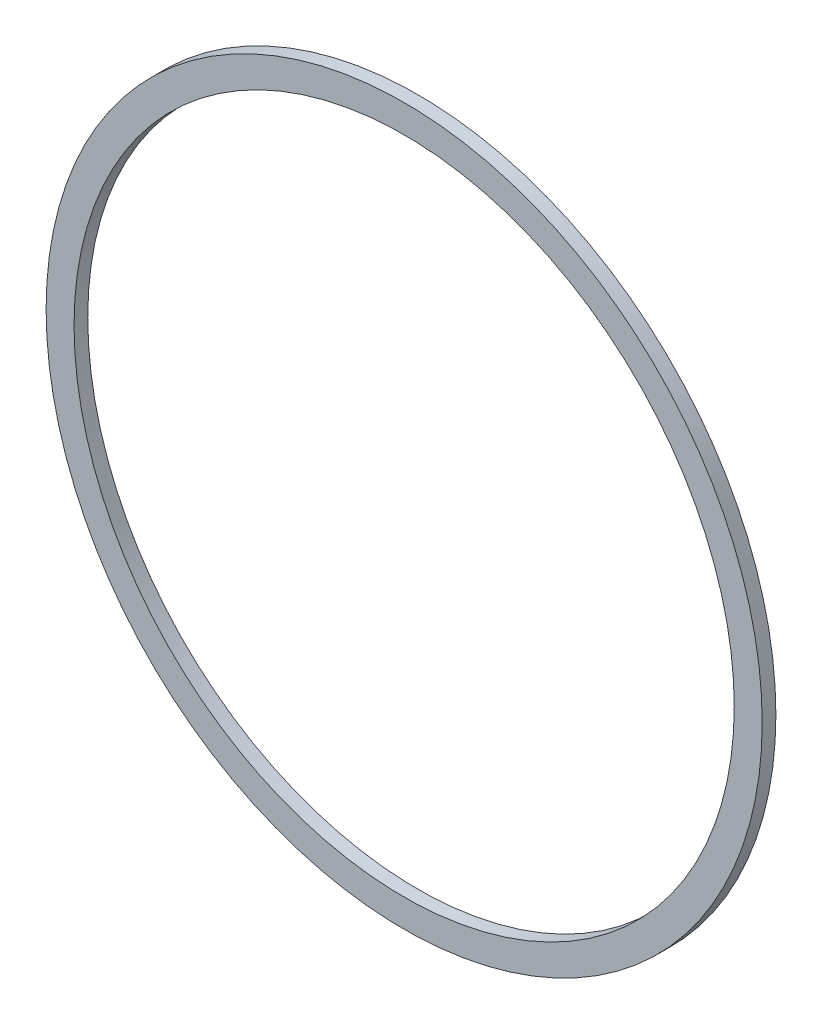
ISO-10303-21;
HEADER;
FILE_DESCRIPTION(('STEP AP214'),'2;1');
FILE_NAME('part.step','',(''),(''),'','','');
FILE_SCHEMA(('AUTOMOTIVE_DESIGN { 1 0 10303 214 1 1 1 1 }'));
ENDSEC;
DATA;
#1=APPLICATION_CONTEXT('core data for automotive mechanical design processes');
#2=APPLICATION_PROTOCOL_DEFINITION('international standard','automotive_design',2000,#1);
#3=PRODUCT_CONTEXT('',#1,'mechanical');
#4=PRODUCT('Part','Part','',(#3));
#5=PRODUCT_RELATED_PRODUCT_CATEGORY('part','',(#4));
#6=PRODUCT_DEFINITION_FORMATION('','',#4);
#7=PRODUCT_DEFINITION_CONTEXT('part definition',#1,'design');
#8=PRODUCT_DEFINITION('design','',#6,#7);
#9=PRODUCT_DEFINITION_SHAPE('','',#8);
#10=(LENGTH_UNIT() NAMED_UNIT(*) SI_UNIT(.MILLI.,.METRE.));
#11=(NAMED_UNIT(*) PLANE_ANGLE_UNIT() SI_UNIT($,.RADIAN.));
#12=(NAMED_UNIT(*) SI_UNIT($,.STERADIAN.) SOLID_ANGLE_UNIT());
#13=UNCERTAINTY_MEASURE_WITH_UNIT(LENGTH_MEASURE(1.E-05),#10,'distance_accuracy_value','');
#14=(GEOMETRIC_REPRESENTATION_CONTEXT(3) GLOBAL_UNCERTAINTY_ASSIGNED_CONTEXT((#13)) GLOBAL_UNIT_ASSIGNED_CONTEXT((#10,
#11,#12)) REPRESENTATION_CONTEXT('',''));
#15=CARTESIAN_POINT('',(0.,0.,0.));
#16=DIRECTION('',(0.,0.,1.));
#17=DIRECTION('',(1.,0.,0.));
#18=AXIS2_PLACEMENT_3D('',#15,#16,#17);
#19=CARTESIAN_POINT('',(0.,0.,3.175));
#20=DIRECTION('',(0.,0.,-1.));
#21=DIRECTION('',(-1.,0.,0.));
#22=AXIS2_PLACEMENT_3D('',#19,#20,#21);
#23=CYLINDRICAL_SURFACE('',#22,82.9945);
#24=CARTESIAN_POINT('',(0.,0.,3.175));
#25=DIRECTION('',(0.,0.,1.));
#26=DIRECTION('',(1.,0.,0.));
#27=AXIS2_PLACEMENT_3D('',#24,#25,#26);
#28=CIRCLE('',#27,82.9945);
#29=CARTESIAN_POINT('',(82.9945,0.,3.175));
#30=VERTEX_POINT('',#29);
#31=EDGE_CURVE('E10',#30,#30,#28,.T.);
#32=ORIENTED_EDGE('',*,*,#31,.F.);
#33=EDGE_LOOP('',(#32));
#34=FACE_BOUND('',#33,.T.);
#35=CARTESIAN_POINT('',(0.,0.,0.));
#36=DIRECTION('',(0.,0.,1.));
#37=DIRECTION('',(1.,0.,0.));
#38=AXIS2_PLACEMENT_3D('',#35,#36,#37);
#39=CIRCLE('',#38,82.9945);
#40=CARTESIAN_POINT('',(82.9945,0.,0.));
#41=VERTEX_POINT('',#40);
#42=EDGE_CURVE('E34',#41,#41,#39,.T.);
#43=ORIENTED_EDGE('',*,*,#42,.T.);
#44=EDGE_LOOP('',(#43));
#45=FACE_BOUND('',#44,.T.);
#46=ADVANCED_FACE('F31',(#34,#45),#23,.T.);
#47=CARTESIAN_POINT('',(0.,0.,3.175));
#48=DIRECTION('',(0.,0.,1.));
#49=DIRECTION('',(1.,0.,0.));
#50=AXIS2_PLACEMENT_3D('',#47,#48,#49);
#51=PLANE('',#50);
#52=CARTESIAN_POINT('',(0.,0.,3.175));
#53=DIRECTION('',(0.,0.,-1.));
#54=DIRECTION('',(-1.,0.,0.));
#55=AXIS2_PLACEMENT_3D('',#52,#53,#54);
#56=CIRCLE('',#55,76.5175);
#57=CARTESIAN_POINT('',(-76.5175,0.,3.175));
#58=VERTEX_POINT('',#57);
#59=EDGE_CURVE('E41',#58,#58,#56,.T.);
#60=ORIENTED_EDGE('',*,*,#59,.T.);
#61=EDGE_LOOP('',(#60));
#62=FACE_BOUND('',#61,.T.);
#63=ORIENTED_EDGE('',*,*,#31,.T.);
#64=EDGE_LOOP('',(#63));
#65=FACE_BOUND('',#64,.T.);
#66=ADVANCED_FACE('F49',(#62,#65),#51,.T.);
#67=CARTESIAN_POINT('',(0.,0.,0.));
#68=DIRECTION('',(0.,0.,1.));
#69=DIRECTION('',(1.,0.,0.));
#70=AXIS2_PLACEMENT_3D('',#67,#68,#69);
#71=PLANE('',#70);
#72=CARTESIAN_POINT('',(0.,0.,0.));
#73=DIRECTION('',(0.,0.,-1.));
#74=DIRECTION('',(-1.,0.,0.));
#75=AXIS2_PLACEMENT_3D('',#72,#73,#74);
#76=CIRCLE('',#75,76.5175);
#77=CARTESIAN_POINT('',(-76.5175,0.,0.));
#78=VERTEX_POINT('',#77);
#79=EDGE_CURVE('E43',#78,#78,#76,.T.);
#80=ORIENTED_EDGE('',*,*,#79,.F.);
#81=EDGE_LOOP('',(#80));
#82=FACE_BOUND('',#81,.T.);
#83=ORIENTED_EDGE('',*,*,#42,.F.);
#84=EDGE_LOOP('',(#83));
#85=FACE_BOUND('',#84,.T.);
#86=ADVANCED_FACE('F54',(#82,#85),#71,.F.);
#87=CARTESIAN_POINT('',(0.,0.,3.175));
#88=DIRECTION('',(0.,0.,-1.));
#89=DIRECTION('',(-1.,0.,0.));
#90=AXIS2_PLACEMENT_3D('',#87,#88,#89);
#91=CYLINDRICAL_SURFACE('',#90,76.5175);
#92=ORIENTED_EDGE('',*,*,#59,.F.);
#93=EDGE_LOOP('',(#92));
#94=FACE_BOUND('',#93,.T.);
#95=ORIENTED_EDGE('',*,*,#79,.T.);
#96=EDGE_LOOP('',(#95));
#97=FACE_BOUND('',#96,.T.);
#98=ADVANCED_FACE('F51',(#94,#97),#91,.F.);
#99=CLOSED_SHELL('',(#46,#66,#86,#98));
#100=MANIFOLD_SOLID_BREP('B2',#99);
#101=ADVANCED_BREP_SHAPE_REPRESENTATION('',(#18,#100),#14);
#102=SHAPE_DEFINITION_REPRESENTATION(#9,#101);
ENDSEC;
END-ISO-10303-21;
